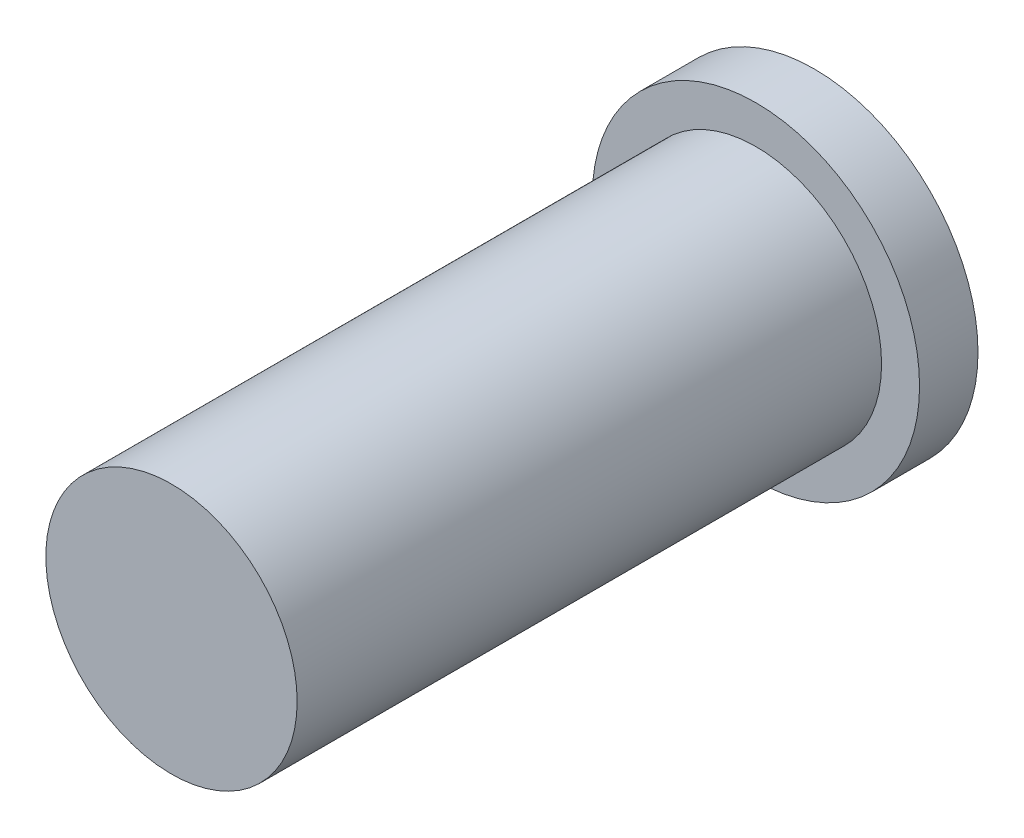
ISO-10303-21;
HEADER;
FILE_DESCRIPTION(('STEP AP214'),'2;1');
FILE_NAME('part.step','',(''),(''),'','','');
FILE_SCHEMA(('AUTOMOTIVE_DESIGN { 1 0 10303 214 1 1 1 1 }'));
ENDSEC;
DATA;
#1=APPLICATION_CONTEXT('core data for automotive mechanical design processes');
#2=APPLICATION_PROTOCOL_DEFINITION('international standard','automotive_design',2000,#1);
#3=PRODUCT_CONTEXT('',#1,'mechanical');
#4=PRODUCT('Part','Part','',(#3));
#5=PRODUCT_RELATED_PRODUCT_CATEGORY('part','',(#4));
#6=PRODUCT_DEFINITION_FORMATION('','',#4);
#7=PRODUCT_DEFINITION_CONTEXT('part definition',#1,'design');
#8=PRODUCT_DEFINITION('design','',#6,#7);
#9=PRODUCT_DEFINITION_SHAPE('','',#8);
#10=(LENGTH_UNIT() NAMED_UNIT(*) SI_UNIT(.MILLI.,.METRE.));
#11=(NAMED_UNIT(*) PLANE_ANGLE_UNIT() SI_UNIT($,.RADIAN.));
#12=(NAMED_UNIT(*) SI_UNIT($,.STERADIAN.) SOLID_ANGLE_UNIT());
#13=UNCERTAINTY_MEASURE_WITH_UNIT(LENGTH_MEASURE(1.E-05),#10,'distance_accuracy_value','');
#14=(GEOMETRIC_REPRESENTATION_CONTEXT(3) GLOBAL_UNCERTAINTY_ASSIGNED_CONTEXT((#13)) GLOBAL_UNIT_ASSIGNED_CONTEXT((#10,
#11,#12)) REPRESENTATION_CONTEXT('',''));
#15=CARTESIAN_POINT('',(0.,0.,0.));
#16=DIRECTION('',(0.,0.,1.));
#17=DIRECTION('',(1.,0.,0.));
#18=AXIS2_PLACEMENT_3D('',#15,#16,#17);
#19=CARTESIAN_POINT('',(0.,0.,10.));
#20=DIRECTION('',(0.,0.,-1.));
#21=DIRECTION('',(-1.,0.,0.));
#22=AXIS2_PLACEMENT_3D('',#19,#20,#21);
#23=CYLINDRICAL_SURFACE('',#22,2.15);
#24=CARTESIAN_POINT('',(0.,0.,10.));
#25=DIRECTION('',(0.,0.,1.));
#26=DIRECTION('',(1.,0.,0.));
#27=AXIS2_PLACEMENT_3D('',#24,#25,#26);
#28=CIRCLE('',#27,2.15);
#29=CARTESIAN_POINT('',(2.15,0.,10.));
#30=VERTEX_POINT('',#29);
#31=EDGE_CURVE('E10',#30,#30,#28,.T.);
#32=ORIENTED_EDGE('',*,*,#31,.F.);
#33=EDGE_LOOP('',(#32));
#34=FACE_BOUND('',#33,.T.);
#35=CARTESIAN_POINT('',(0.,0.,0.));
#36=DIRECTION('',(0.,0.,1.));
#37=DIRECTION('',(1.,0.,0.));
#38=AXIS2_PLACEMENT_3D('',#35,#36,#37);
#39=CIRCLE('',#38,2.15);
#40=CARTESIAN_POINT('',(2.15,0.,0.));
#41=VERTEX_POINT('',#40);
#42=EDGE_CURVE('E42',#41,#41,#39,.T.);
#43=ORIENTED_EDGE('',*,*,#42,.T.);
#44=EDGE_LOOP('',(#43));
#45=FACE_BOUND('',#44,.T.);
#46=ADVANCED_FACE('F39',(#34,#45),#23,.T.);
#47=CARTESIAN_POINT('',(0.,0.,10.));
#48=DIRECTION('',(0.,0.,1.));
#49=DIRECTION('',(1.,0.,0.));
#50=AXIS2_PLACEMENT_3D('',#47,#48,#49);
#51=PLANE('',#50);
#52=ORIENTED_EDGE('',*,*,#31,.T.);
#53=EDGE_LOOP('',(#52));
#54=FACE_BOUND('',#53,.T.);
#55=ADVANCED_FACE('F74',(#54),#51,.T.);
#56=CARTESIAN_POINT('',(0.,0.,-1.));
#57=DIRECTION('',(0.,0.,1.));
#58=DIRECTION('',(1.,0.,0.));
#59=AXIS2_PLACEMENT_3D('',#56,#57,#58);
#60=CYLINDRICAL_SURFACE('',#59,2.8);
#61=CARTESIAN_POINT('',(0.,0.,-1.));
#62=DIRECTION('',(0.,0.,1.));
#63=DIRECTION('',(1.,0.,0.));
#64=AXIS2_PLACEMENT_3D('',#61,#62,#63);
#65=CIRCLE('',#64,2.8);
#66=CARTESIAN_POINT('',(2.8,0.,-1.));
#67=VERTEX_POINT('',#66);
#68=EDGE_CURVE('E51',#67,#67,#65,.T.);
#69=ORIENTED_EDGE('',*,*,#68,.T.);
#70=EDGE_LOOP('',(#69));
#71=FACE_BOUND('',#70,.T.);
#72=CARTESIAN_POINT('',(0.,0.,0.));
#73=DIRECTION('',(0.,0.,1.));
#74=DIRECTION('',(1.,0.,0.));
#75=AXIS2_PLACEMENT_3D('',#72,#73,#74);
#76=CIRCLE('',#75,2.8);
#77=CARTESIAN_POINT('',(2.8,0.,0.));
#78=VERTEX_POINT('',#77);
#79=EDGE_CURVE('E53',#78,#78,#76,.T.);
#80=ORIENTED_EDGE('',*,*,#79,.F.);
#81=EDGE_LOOP('',(#80));
#82=FACE_BOUND('',#81,.T.);
#83=ADVANCED_FACE('F61',(#71,#82),#60,.T.);
#84=CARTESIAN_POINT('',(0.,0.,-1.));
#85=DIRECTION('',(0.,0.,1.));
#86=DIRECTION('',(1.,0.,0.));
#87=AXIS2_PLACEMENT_3D('',#84,#85,#86);
#88=PLANE('',#87);
#89=ORIENTED_EDGE('',*,*,#68,.F.);
#90=EDGE_LOOP('',(#89));
#91=FACE_BOUND('',#90,.T.);
#92=ADVANCED_FACE('F64',(#91),#88,.F.);
#93=CARTESIAN_POINT('',(0.,0.,0.));
#94=DIRECTION('',(0.,0.,1.));
#95=DIRECTION('',(1.,0.,0.));
#96=AXIS2_PLACEMENT_3D('',#93,#94,#95);
#97=PLANE('',#96);
#98=ORIENTED_EDGE('',*,*,#42,.F.);
#99=EDGE_LOOP('',(#98));
#100=FACE_BOUND('',#99,.T.);
#101=ORIENTED_EDGE('',*,*,#79,.T.);
#102=EDGE_LOOP('',(#101));
#103=FACE_BOUND('',#102,.T.);
#104=ADVANCED_FACE('F66',(#100,#103),#97,.T.);
#105=CLOSED_SHELL('',(#46,#55,#83,#92,#104));
#106=MANIFOLD_SOLID_BREP('B2',#105);
#107=ADVANCED_BREP_SHAPE_REPRESENTATION('',(#18,#106),#14);
#108=SHAPE_DEFINITION_REPRESENTATION(#9,#107);
ENDSEC;
END-ISO-10303-21;
